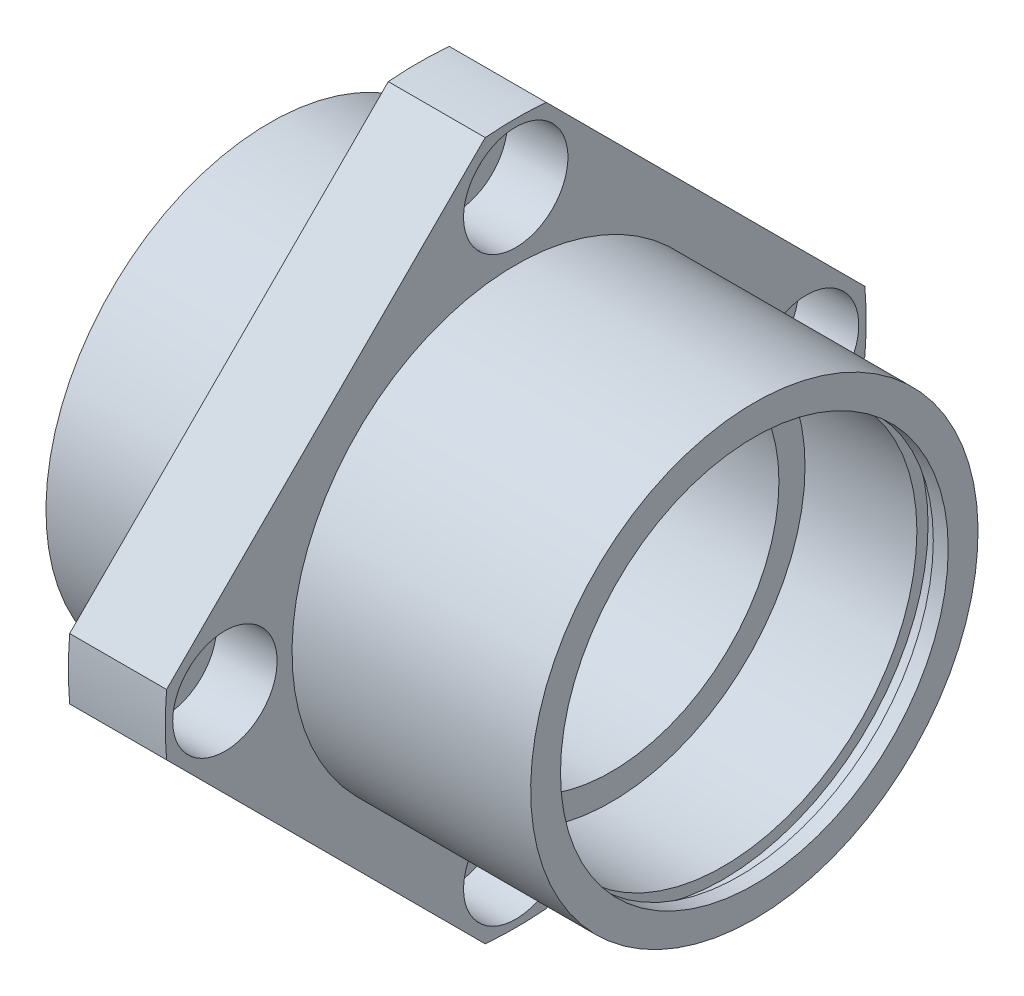
ISO-10303-21;
HEADER;
FILE_DESCRIPTION(('STEP AP214'),'2;1');
FILE_NAME('part.step','',(''),(''),'','','');
FILE_SCHEMA(('AUTOMOTIVE_DESIGN { 1 0 10303 214 1 1 1 1 }'));
ENDSEC;
DATA;
#1=APPLICATION_CONTEXT('core data for automotive mechanical design processes');
#2=APPLICATION_PROTOCOL_DEFINITION('international standard','automotive_design',2000,#1);
#3=PRODUCT_CONTEXT('',#1,'mechanical');
#4=PRODUCT('Part','Part','',(#3));
#5=PRODUCT_RELATED_PRODUCT_CATEGORY('part','',(#4));
#6=PRODUCT_DEFINITION_FORMATION('','',#4);
#7=PRODUCT_DEFINITION_CONTEXT('part definition',#1,'design');
#8=PRODUCT_DEFINITION('design','',#6,#7);
#9=PRODUCT_DEFINITION_SHAPE('','',#8);
#10=(LENGTH_UNIT() NAMED_UNIT(*) SI_UNIT(.MILLI.,.METRE.));
#11=(NAMED_UNIT(*) PLANE_ANGLE_UNIT() SI_UNIT($,.RADIAN.));
#12=(NAMED_UNIT(*) SI_UNIT($,.STERADIAN.) SOLID_ANGLE_UNIT());
#13=UNCERTAINTY_MEASURE_WITH_UNIT(LENGTH_MEASURE(1.E-05),#10,'distance_accuracy_value','');
#14=(GEOMETRIC_REPRESENTATION_CONTEXT(3) GLOBAL_UNCERTAINTY_ASSIGNED_CONTEXT((#13)) GLOBAL_UNIT_ASSIGNED_CONTEXT((#10,
#11,#12)) REPRESENTATION_CONTEXT('',''));
#15=CARTESIAN_POINT('',(0.,0.,0.));
#16=DIRECTION('',(0.,0.,1.));
#17=DIRECTION('',(1.,0.,0.));
#18=AXIS2_PLACEMENT_3D('',#15,#16,#17);
#19=CARTESIAN_POINT('',(-45.,30.,0.));
#20=DIRECTION('',(1.,0.,0.));
#21=DIRECTION('',(0.,1.,0.));
#22=AXIS2_PLACEMENT_3D('',#19,#20,#21);
#23=PLANE('',#22);
#24=CARTESIAN_POINT('',(-45.,0.,-39.));
#25=DIRECTION('',(-1.,0.,0.));
#26=DIRECTION('',(0.,0.,1.));
#27=AXIS2_PLACEMENT_3D('',#24,#25,#26);
#28=CIRCLE('',#27,4.5);
#29=CARTESIAN_POINT('',(-45.,0.,-34.5));
#30=VERTEX_POINT('',#29);
#31=EDGE_CURVE('E226',#30,#30,#28,.T.);
#32=ORIENTED_EDGE('',*,*,#31,.F.);
#33=EDGE_LOOP('',(#32));
#34=FACE_BOUND('',#33,.T.);
#35=CARTESIAN_POINT('',(-45.,-39.,0.));
#36=DIRECTION('',(-1.,0.,0.));
#37=DIRECTION('',(0.,0.,1.));
#38=AXIS2_PLACEMENT_3D('',#35,#36,#37);
#39=CIRCLE('',#38,4.5);
#40=CARTESIAN_POINT('',(-45.,-39.,4.5));
#41=VERTEX_POINT('',#40);
#42=EDGE_CURVE('E214',#41,#41,#39,.T.);
#43=ORIENTED_EDGE('',*,*,#42,.F.);
#44=EDGE_LOOP('',(#43));
#45=FACE_BOUND('',#44,.T.);
#46=CARTESIAN_POINT('',(-45.,0.,39.));
#47=DIRECTION('',(-1.,0.,0.));
#48=DIRECTION('',(0.,0.,1.));
#49=AXIS2_PLACEMENT_3D('',#46,#47,#48);
#50=CIRCLE('',#49,4.5);
#51=CARTESIAN_POINT('',(-45.,0.,43.5));
#52=VERTEX_POINT('',#51);
#53=EDGE_CURVE('E201',#52,#52,#50,.T.);
#54=ORIENTED_EDGE('',*,*,#53,.F.);
#55=EDGE_LOOP('',(#54));
#56=FACE_BOUND('',#55,.T.);
#57=CARTESIAN_POINT('',(-45.,39.,0.));
#58=DIRECTION('',(-1.,0.,0.));
#59=DIRECTION('',(0.,0.,1.));
#60=AXIS2_PLACEMENT_3D('',#57,#58,#59);
#61=CIRCLE('',#60,4.5);
#62=CARTESIAN_POINT('',(-45.,39.,4.5));
#63=VERTEX_POINT('',#62);
#64=EDGE_CURVE('E193',#63,#63,#61,.T.);
#65=ORIENTED_EDGE('',*,*,#64,.F.);
#66=EDGE_LOOP('',(#65));
#67=FACE_BOUND('',#66,.T.);
#68=CARTESIAN_POINT('',(-45.,0.,0.));
#69=DIRECTION('',(-1.,0.,0.));
#70=DIRECTION('',(0.,-1.,0.));
#71=AXIS2_PLACEMENT_3D('',#68,#69,#70);
#72=CIRCLE('',#71,30.);
#73=CARTESIAN_POINT('',(-45.,-30.,0.));
#74=VERTEX_POINT('',#73);
#75=EDGE_CURVE('E262',#74,#74,#72,.T.);
#76=ORIENTED_EDGE('',*,*,#75,.F.);
#77=EDGE_LOOP('',(#76));
#78=FACE_BOUND('',#77,.T.);
#79=DIRECTION('',(0.,-0.707106781186547,0.707106781186548));
#80=VECTOR('',#79,1.);
#81=CARTESIAN_POINT('',(-45.,50.911688245431,0.));
#82=LINE('',#81,#80);
#83=CARTESIAN_POINT('',(-45.,46.8217047419373,4.08998350349376));
#84=VERTEX_POINT('',#83);
#85=CARTESIAN_POINT('',(-45.,4.08998350349378,46.8217047419372));
#86=VERTEX_POINT('',#85);
#87=EDGE_CURVE('E258',#84,#86,#82,.T.);
#88=ORIENTED_EDGE('',*,*,#87,.F.);
#89=CARTESIAN_POINT('',(-45.,0.,0.));
#90=DIRECTION('',(-1.,0.,0.));
#91=DIRECTION('',(0.,-1.,0.));
#92=AXIS2_PLACEMENT_3D('',#89,#90,#91);
#93=CIRCLE('',#92,47.);
#94=CARTESIAN_POINT('',(-45.,46.8217047419373,-4.08998350349373));
#95=VERTEX_POINT('',#94);
#96=EDGE_CURVE('E264',#84,#95,#93,.T.);
#97=ORIENTED_EDGE('',*,*,#96,.T.);
#98=DIRECTION('',(0.,0.707106781186548,0.707106781186548));
#99=VECTOR('',#98,1.);
#100=CARTESIAN_POINT('',(-45.,0.,-50.911688245431));
#101=LINE('',#100,#99);
#102=CARTESIAN_POINT('',(-45.,4.08998350349376,-46.8217047419372));
#103=VERTEX_POINT('',#102);
#104=EDGE_CURVE('E249',#103,#95,#101,.T.);
#105=ORIENTED_EDGE('',*,*,#104,.F.);
#106=CARTESIAN_POINT('',(-45.,-4.08998350349379,-46.8217047419372));
#107=VERTEX_POINT('',#106);
#108=EDGE_CURVE('E135',#103,#107,#93,.T.);
#109=ORIENTED_EDGE('',*,*,#108,.T.);
#110=DIRECTION('',(0.,0.707106781186547,-0.707106781186547));
#111=VECTOR('',#110,1.);
#112=CARTESIAN_POINT('',(-45.,-50.911688245431,0.));
#113=LINE('',#112,#111);
#114=CARTESIAN_POINT('',(-45.,-46.8217047419372,-4.08998350349378));
#115=VERTEX_POINT('',#114);
#116=EDGE_CURVE('E252',#115,#107,#113,.T.);
#117=ORIENTED_EDGE('',*,*,#116,.F.);
#118=CARTESIAN_POINT('',(-45.,-46.8217047419372,4.08998350349377));
#119=VERTEX_POINT('',#118);
#120=EDGE_CURVE('E126',#115,#119,#93,.T.);
#121=ORIENTED_EDGE('',*,*,#120,.T.);
#122=DIRECTION('',(0.,-0.707106781186548,-0.707106781186547));
#123=VECTOR('',#122,1.);
#124=CARTESIAN_POINT('',(-45.,0.,50.911688245431));
#125=LINE('',#124,#123);
#126=CARTESIAN_POINT('',(-45.,-4.08998350349374,46.8217047419372));
#127=VERTEX_POINT('',#126);
#128=EDGE_CURVE('E255',#127,#119,#125,.T.);
#129=ORIENTED_EDGE('',*,*,#128,.F.);
#130=EDGE_CURVE('E123',#127,#86,#93,.T.);
#131=ORIENTED_EDGE('',*,*,#130,.T.);
#132=EDGE_LOOP('',(#88,#97,#105,#109,#117,#121,#129,#131));
#133=FACE_BOUND('',#132,.T.);
#134=ADVANCED_FACE('F39',(#34,#45,#56,#67,#78,#133),#23,.F.);
#135=CARTESIAN_POINT('',(0.,0.,0.));
#136=DIRECTION('',(-1.,0.,0.));
#137=DIRECTION('',(0.,-1.,0.));
#138=AXIS2_PLACEMENT_3D('',#135,#136,#137);
#139=CYLINDRICAL_SURFACE('',#138,47.);
#140=DIRECTION('',(-1.,0.,0.));
#141=VECTOR('',#140,1.);
#142=CARTESIAN_POINT('',(0.,46.8217047419373,4.08998350349375));
#143=LINE('',#142,#141);
#144=CARTESIAN_POINT('',(-32.,46.8217047419372,4.08998350349376));
#145=VERTEX_POINT('',#144);
#146=EDGE_CURVE('E239',#145,#84,#143,.T.);
#147=ORIENTED_EDGE('',*,*,#146,.F.);
#148=CARTESIAN_POINT('',(-32.,0.,0.));
#149=DIRECTION('',(-1.,0.,0.));
#150=DIRECTION('',(0.,-1.,0.));
#151=AXIS2_PLACEMENT_3D('',#148,#149,#150);
#152=CIRCLE('',#151,47.);
#153=CARTESIAN_POINT('',(-32.,46.8217047419373,-4.08998350349374));
#154=VERTEX_POINT('',#153);
#155=EDGE_CURVE('E129',#145,#154,#152,.T.);
#156=ORIENTED_EDGE('',*,*,#155,.T.);
#157=DIRECTION('',(-1.,0.,0.));
#158=VECTOR('',#157,1.);
#159=CARTESIAN_POINT('',(0.,46.8217047419373,-4.08998350349375));
#160=LINE('',#159,#158);
#161=EDGE_CURVE('E61',#95,#154,#160,.F.);
#162=ORIENTED_EDGE('',*,*,#161,.F.);
#163=ORIENTED_EDGE('',*,*,#96,.F.);
#164=EDGE_LOOP('',(#147,#156,#162,#163));
#165=FACE_BOUND('',#164,.T.);
#166=ADVANCED_FACE('F283',(#165),#139,.T.);
#167=DIRECTION('',(-1.,0.,0.));
#168=VECTOR('',#167,1.);
#169=CARTESIAN_POINT('',(0.,4.08998350349378,46.8217047419372));
#170=LINE('',#169,#168);
#171=CARTESIAN_POINT('',(-32.,4.08998350349379,46.8217047419372));
#172=VERTEX_POINT('',#171);
#173=EDGE_CURVE('E244',#86,#172,#170,.F.);
#174=ORIENTED_EDGE('',*,*,#173,.F.);
#175=ORIENTED_EDGE('',*,*,#130,.F.);
#176=DIRECTION('',(-1.,0.,0.));
#177=VECTOR('',#176,1.);
#178=CARTESIAN_POINT('',(0.,-4.08998350349373,46.8217047419372));
#179=LINE('',#178,#177);
#180=CARTESIAN_POINT('',(-32.,-4.08998350349372,46.8217047419373));
#181=VERTEX_POINT('',#180);
#182=EDGE_CURVE('E104',#181,#127,#179,.T.);
#183=ORIENTED_EDGE('',*,*,#182,.F.);
#184=EDGE_CURVE('E122',#181,#172,#152,.T.);
#185=ORIENTED_EDGE('',*,*,#184,.T.);
#186=EDGE_LOOP('',(#174,#175,#183,#185));
#187=FACE_BOUND('',#186,.T.);
#188=ADVANCED_FACE('F117',(#187),#139,.T.);
#189=DIRECTION('',(-1.,0.,0.));
#190=VECTOR('',#189,1.);
#191=CARTESIAN_POINT('',(0.,4.08998350349377,-46.8217047419372));
#192=LINE('',#191,#190);
#193=CARTESIAN_POINT('',(-32.,4.08998350349375,-46.8217047419372));
#194=VERTEX_POINT('',#193);
#195=EDGE_CURVE('E245',#194,#103,#192,.T.);
#196=ORIENTED_EDGE('',*,*,#195,.F.);
#197=CARTESIAN_POINT('',(-32.,-4.08998350349376,-46.8217047419372));
#198=VERTEX_POINT('',#197);
#199=EDGE_CURVE('E138',#194,#198,#152,.T.);
#200=ORIENTED_EDGE('',*,*,#199,.T.);
#201=DIRECTION('',(-1.,0.,0.));
#202=VECTOR('',#201,1.);
#203=CARTESIAN_POINT('',(0.,-4.08998350349378,-46.8217047419372));
#204=LINE('',#203,#202);
#205=EDGE_CURVE('E53',#107,#198,#204,.F.);
#206=ORIENTED_EDGE('',*,*,#205,.F.);
#207=ORIENTED_EDGE('',*,*,#108,.F.);
#208=EDGE_LOOP('',(#196,#200,#206,#207));
#209=FACE_BOUND('',#208,.T.);
#210=ADVANCED_FACE('F280',(#209),#139,.T.);
#211=DIRECTION('',(-1.,0.,0.));
#212=VECTOR('',#211,1.);
#213=CARTESIAN_POINT('',(0.,-46.8217047419372,-4.08998350349379));
#214=LINE('',#213,#212);
#215=CARTESIAN_POINT('',(-32.,-46.8217047419372,-4.08998350349377));
#216=VERTEX_POINT('',#215);
#217=EDGE_CURVE('E248',#216,#115,#214,.T.);
#218=ORIENTED_EDGE('',*,*,#217,.F.);
#219=CARTESIAN_POINT('',(-32.,-46.8217047419372,4.08998350349374));
#220=VERTEX_POINT('',#219);
#221=EDGE_CURVE('E134',#216,#220,#152,.T.);
#222=ORIENTED_EDGE('',*,*,#221,.T.);
#223=DIRECTION('',(-1.,0.,0.));
#224=VECTOR('',#223,1.);
#225=CARTESIAN_POINT('',(0.,-46.8217047419372,4.08998350349377));
#226=LINE('',#225,#224);
#227=EDGE_CURVE('E107',#119,#220,#226,.F.);
#228=ORIENTED_EDGE('',*,*,#227,.F.);
#229=ORIENTED_EDGE('',*,*,#120,.F.);
#230=EDGE_LOOP('',(#218,#222,#228,#229));
#231=FACE_BOUND('',#230,.T.);
#232=ADVANCED_FACE('F281',(#231),#139,.T.);
#233=CARTESIAN_POINT('',(-32.,47.,0.));
#234=DIRECTION('',(-1.,0.,0.));
#235=DIRECTION('',(0.,-1.,0.));
#236=AXIS2_PLACEMENT_3D('',#233,#234,#235);
#237=PLANE('',#236);
#238=CARTESIAN_POINT('',(-32.,0.,-39.));
#239=DIRECTION('',(-1.,0.,0.));
#240=DIRECTION('',(0.,0.,1.));
#241=AXIS2_PLACEMENT_3D('',#238,#239,#240);
#242=CIRCLE('',#241,7.);
#243=CARTESIAN_POINT('',(-32.,0.,-32.));
#244=VERTEX_POINT('',#243);
#245=EDGE_CURVE('E237',#244,#244,#242,.T.);
#246=ORIENTED_EDGE('',*,*,#245,.T.);
#247=EDGE_LOOP('',(#246));
#248=FACE_BOUND('',#247,.T.);
#249=CARTESIAN_POINT('',(-32.,-39.,0.));
#250=DIRECTION('',(-1.,0.,0.));
#251=DIRECTION('',(0.,0.,1.));
#252=AXIS2_PLACEMENT_3D('',#249,#250,#251);
#253=CIRCLE('',#252,7.);
#254=CARTESIAN_POINT('',(-32.,-39.,7.));
#255=VERTEX_POINT('',#254);
#256=EDGE_CURVE('E221',#255,#255,#253,.T.);
#257=ORIENTED_EDGE('',*,*,#256,.T.);
#258=EDGE_LOOP('',(#257));
#259=FACE_BOUND('',#258,.T.);
#260=CARTESIAN_POINT('',(-32.,0.,39.));
#261=DIRECTION('',(-1.,0.,0.));
#262=DIRECTION('',(0.,0.,1.));
#263=AXIS2_PLACEMENT_3D('',#260,#261,#262);
#264=CIRCLE('',#263,7.);
#265=CARTESIAN_POINT('',(-32.,0.,46.));
#266=VERTEX_POINT('',#265);
#267=EDGE_CURVE('E215',#266,#266,#264,.T.);
#268=ORIENTED_EDGE('',*,*,#267,.T.);
#269=EDGE_LOOP('',(#268));
#270=FACE_BOUND('',#269,.T.);
#271=CARTESIAN_POINT('',(-32.,39.,0.));
#272=DIRECTION('',(-1.,0.,0.));
#273=DIRECTION('',(0.,0.,1.));
#274=AXIS2_PLACEMENT_3D('',#271,#272,#273);
#275=CIRCLE('',#274,7.);
#276=CARTESIAN_POINT('',(-32.,39.,7.));
#277=VERTEX_POINT('',#276);
#278=EDGE_CURVE('E199',#277,#277,#275,.T.);
#279=ORIENTED_EDGE('',*,*,#278,.T.);
#280=EDGE_LOOP('',(#279));
#281=FACE_BOUND('',#280,.T.);
#282=CARTESIAN_POINT('',(-32.,0.,0.));
#283=DIRECTION('',(-1.,0.,0.));
#284=DIRECTION('',(0.,-1.,0.));
#285=AXIS2_PLACEMENT_3D('',#282,#283,#284);
#286=CIRCLE('',#285,30.);
#287=CARTESIAN_POINT('',(-32.,-30.,0.));
#288=VERTEX_POINT('',#287);
#289=EDGE_CURVE('E136',#288,#288,#286,.T.);
#290=ORIENTED_EDGE('',*,*,#289,.T.);
#291=EDGE_LOOP('',(#290));
#292=FACE_BOUND('',#291,.T.);
#293=DIRECTION('',(0.,0.707106781186547,-0.707106781186548));
#294=VECTOR('',#293,1.);
#295=CARTESIAN_POINT('',(-32.,48.9558441227155,1.95584412271551));
#296=LINE('',#295,#294);
#297=EDGE_CURVE('E11',#172,#145,#296,.T.);
#298=ORIENTED_EDGE('',*,*,#297,.F.);
#299=ORIENTED_EDGE('',*,*,#184,.F.);
#300=DIRECTION('',(0.,0.707106781186548,0.707106781186547));
#301=VECTOR('',#300,1.);
#302=CARTESIAN_POINT('',(-32.,-1.95584412271546,48.9558441227155));
#303=LINE('',#302,#301);
#304=EDGE_CURVE('E105',#220,#181,#303,.T.);
#305=ORIENTED_EDGE('',*,*,#304,.F.);
#306=ORIENTED_EDGE('',*,*,#221,.F.);
#307=DIRECTION('',(0.,-0.707106781186548,0.707106781186548));
#308=VECTOR('',#307,1.);
#309=CARTESIAN_POINT('',(-32.,-1.9558441227155,-48.9558441227155));
#310=LINE('',#309,#308);
#311=EDGE_CURVE('E114',#198,#216,#310,.T.);
#312=ORIENTED_EDGE('',*,*,#311,.F.);
#313=ORIENTED_EDGE('',*,*,#199,.F.);
#314=DIRECTION('',(0.,-0.707106781186547,-0.707106781186548));
#315=VECTOR('',#314,1.);
#316=CARTESIAN_POINT('',(-32.,48.9558441227155,-1.95584412271549));
#317=LINE('',#316,#315);
#318=EDGE_CURVE('E50',#154,#194,#317,.T.);
#319=ORIENTED_EDGE('',*,*,#318,.F.);
#320=ORIENTED_EDGE('',*,*,#155,.F.);
#321=EDGE_LOOP('',(#298,#299,#305,#306,#312,#313,#319,#320));
#322=FACE_BOUND('',#321,.T.);
#323=ADVANCED_FACE('F127',(#248,#259,#270,#281,#292,#322),#237,.F.);
#324=CARTESIAN_POINT('',(-65.,0.,0.));
#325=DIRECTION('',(1.,0.,0.));
#326=DIRECTION('',(0.,1.,0.));
#327=AXIS2_PLACEMENT_3D('',#324,#325,#326);
#328=PLANE('',#327);
#329=CARTESIAN_POINT('',(-65.,0.,0.));
#330=DIRECTION('',(-1.,0.,0.));
#331=DIRECTION('',(0.,0.,1.));
#332=AXIS2_PLACEMENT_3D('',#329,#330,#331);
#333=CIRCLE('',#332,26.);
#334=CARTESIAN_POINT('',(-65.,0.,26.));
#335=VERTEX_POINT('',#334);
#336=EDGE_CURVE('E150',#335,#335,#333,.T.);
#337=ORIENTED_EDGE('',*,*,#336,.F.);
#338=EDGE_LOOP('',(#337));
#339=FACE_BOUND('',#338,.T.);
#340=CARTESIAN_POINT('',(-65.,0.,0.));
#341=DIRECTION('',(-1.,0.,0.));
#342=DIRECTION('',(0.,-1.,0.));
#343=AXIS2_PLACEMENT_3D('',#340,#341,#342);
#344=CIRCLE('',#343,30.);
#345=CARTESIAN_POINT('',(-65.,-30.,0.));
#346=VERTEX_POINT('',#345);
#347=EDGE_CURVE('E111',#346,#346,#344,.T.);
#348=ORIENTED_EDGE('',*,*,#347,.T.);
#349=EDGE_LOOP('',(#348));
#350=FACE_BOUND('',#349,.T.);
#351=ADVANCED_FACE('F41',(#339,#350),#328,.F.);
#352=CARTESIAN_POINT('',(0.,0.,0.));
#353=DIRECTION('',(-1.,0.,0.));
#354=DIRECTION('',(0.,-1.,0.));
#355=AXIS2_PLACEMENT_3D('',#352,#353,#354);
#356=CYLINDRICAL_SURFACE('',#355,30.);
#357=ORIENTED_EDGE('',*,*,#347,.F.);
#358=EDGE_LOOP('',(#357));
#359=FACE_BOUND('',#358,.T.);
#360=ORIENTED_EDGE('',*,*,#75,.T.);
#361=EDGE_LOOP('',(#360));
#362=FACE_BOUND('',#361,.T.);
#363=ADVANCED_FACE('F443',(#359,#362),#356,.T.);
#364=CARTESIAN_POINT('',(0.,0.,0.));
#365=DIRECTION('',(-1.,0.,0.));
#366=DIRECTION('',(0.,-1.,0.));
#367=AXIS2_PLACEMENT_3D('',#364,#365,#366);
#368=CYLINDRICAL_SURFACE('',#367,30.);
#369=ORIENTED_EDGE('',*,*,#289,.F.);
#370=EDGE_LOOP('',(#369));
#371=FACE_BOUND('',#370,.T.);
#372=CARTESIAN_POINT('',(0.,0.,0.));
#373=DIRECTION('',(-1.,0.,0.));
#374=DIRECTION('',(0.,-1.,0.));
#375=AXIS2_PLACEMENT_3D('',#372,#373,#374);
#376=CIRCLE('',#375,30.);
#377=CARTESIAN_POINT('',(0.,-30.,0.));
#378=VERTEX_POINT('',#377);
#379=EDGE_CURVE('E141',#378,#378,#376,.T.);
#380=ORIENTED_EDGE('',*,*,#379,.T.);
#381=EDGE_LOOP('',(#380));
#382=FACE_BOUND('',#381,.T.);
#383=ADVANCED_FACE('F445',(#371,#382),#368,.T.);
#384=CARTESIAN_POINT('',(0.,30.,0.));
#385=DIRECTION('',(-1.,0.,0.));
#386=DIRECTION('',(0.,-1.,0.));
#387=AXIS2_PLACEMENT_3D('',#384,#385,#386);
#388=PLANE('',#387);
#389=CARTESIAN_POINT('',(0.,0.,0.));
#390=DIRECTION('',(-1.,0.,0.));
#391=DIRECTION('',(0.,0.,1.));
#392=AXIS2_PLACEMENT_3D('',#389,#390,#391);
#393=CIRCLE('',#392,26.);
#394=CARTESIAN_POINT('',(0.,0.,26.));
#395=VERTEX_POINT('',#394);
#396=EDGE_CURVE('E190',#395,#395,#393,.T.);
#397=ORIENTED_EDGE('',*,*,#396,.T.);
#398=EDGE_LOOP('',(#397));
#399=FACE_BOUND('',#398,.T.);
#400=ORIENTED_EDGE('',*,*,#379,.F.);
#401=EDGE_LOOP('',(#400));
#402=FACE_BOUND('',#401,.T.);
#403=ADVANCED_FACE('F437',(#399,#402),#388,.F.);
#404=CARTESIAN_POINT('',(0.,0.,0.));
#405=DIRECTION('',(-1.,0.,0.));
#406=DIRECTION('',(0.,0.,1.));
#407=AXIS2_PLACEMENT_3D('',#404,#405,#406);
#408=CYLINDRICAL_SURFACE('',#407,26.);
#409=ORIENTED_EDGE('',*,*,#336,.T.);
#410=EDGE_LOOP('',(#409));
#411=FACE_BOUND('',#410,.T.);
#412=CARTESIAN_POINT('',(-63.,0.,0.));
#413=DIRECTION('',(-1.,0.,0.));
#414=DIRECTION('',(0.,0.,1.));
#415=AXIS2_PLACEMENT_3D('',#412,#413,#414);
#416=CIRCLE('',#415,26.);
#417=CARTESIAN_POINT('',(-63.,0.,26.));
#418=VERTEX_POINT('',#417);
#419=EDGE_CURVE('E155',#418,#418,#416,.T.);
#420=ORIENTED_EDGE('',*,*,#419,.F.);
#421=EDGE_LOOP('',(#420));
#422=FACE_BOUND('',#421,.T.);
#423=ADVANCED_FACE('F432',(#411,#422),#408,.F.);
#424=CARTESIAN_POINT('',(-63.,26.,0.));
#425=DIRECTION('',(1.,0.,0.));
#426=DIRECTION('',(0.,0.,-1.));
#427=AXIS2_PLACEMENT_3D('',#424,#425,#426);
#428=PLANE('',#427);
#429=ORIENTED_EDGE('',*,*,#419,.T.);
#430=EDGE_LOOP('',(#429));
#431=FACE_BOUND('',#430,.T.);
#432=CARTESIAN_POINT('',(-63.,0.,0.));
#433=DIRECTION('',(-1.,0.,0.));
#434=DIRECTION('',(0.,0.,1.));
#435=AXIS2_PLACEMENT_3D('',#432,#433,#434);
#436=CIRCLE('',#435,27.5);
#437=CARTESIAN_POINT('',(-63.,0.,27.5));
#438=VERTEX_POINT('',#437);
#439=EDGE_CURVE('E154',#438,#438,#436,.T.);
#440=ORIENTED_EDGE('',*,*,#439,.F.);
#441=EDGE_LOOP('',(#440));
#442=FACE_BOUND('',#441,.T.);
#443=ADVANCED_FACE('F429',(#431,#442),#428,.T.);
#444=CARTESIAN_POINT('',(0.,0.,0.));
#445=DIRECTION('',(-1.,0.,0.));
#446=DIRECTION('',(0.,0.,1.));
#447=AXIS2_PLACEMENT_3D('',#444,#445,#446);
#448=CYLINDRICAL_SURFACE('',#447,27.5);
#449=ORIENTED_EDGE('',*,*,#439,.T.);
#450=EDGE_LOOP('',(#449));
#451=FACE_BOUND('',#450,.T.);
#452=CARTESIAN_POINT('',(-60.8,0.,0.));
#453=DIRECTION('',(-1.,0.,0.));
#454=DIRECTION('',(0.,0.,1.));
#455=AXIS2_PLACEMENT_3D('',#452,#453,#454);
#456=CIRCLE('',#455,27.5);
#457=CARTESIAN_POINT('',(-60.8,0.,27.5));
#458=VERTEX_POINT('',#457);
#459=EDGE_CURVE('E158',#458,#458,#456,.T.);
#460=ORIENTED_EDGE('',*,*,#459,.F.);
#461=EDGE_LOOP('',(#460));
#462=FACE_BOUND('',#461,.T.);
#463=ADVANCED_FACE('F426',(#451,#462),#448,.F.);
#464=CARTESIAN_POINT('',(-60.8,27.5,0.));
#465=DIRECTION('',(-1.,0.,0.));
#466=DIRECTION('',(0.,0.,1.));
#467=AXIS2_PLACEMENT_3D('',#464,#465,#466);
#468=PLANE('',#467);
#469=ORIENTED_EDGE('',*,*,#459,.T.);
#470=EDGE_LOOP('',(#469));
#471=FACE_BOUND('',#470,.T.);
#472=CARTESIAN_POINT('',(-60.8,0.,0.));
#473=DIRECTION('',(-1.,0.,0.));
#474=DIRECTION('',(0.,0.,1.));
#475=AXIS2_PLACEMENT_3D('',#472,#473,#474);
#476=CIRCLE('',#475,26.);
#477=CARTESIAN_POINT('',(-60.8,0.,26.));
#478=VERTEX_POINT('',#477);
#479=EDGE_CURVE('E161',#478,#478,#476,.T.);
#480=ORIENTED_EDGE('',*,*,#479,.F.);
#481=EDGE_LOOP('',(#480));
#482=FACE_BOUND('',#481,.T.);
#483=ADVANCED_FACE('F425',(#471,#482),#468,.T.);
#484=CARTESIAN_POINT('',(0.,0.,0.));
#485=DIRECTION('',(-1.,0.,0.));
#486=DIRECTION('',(0.,0.,1.));
#487=AXIS2_PLACEMENT_3D('',#484,#485,#486);
#488=CYLINDRICAL_SURFACE('',#487,26.);
#489=ORIENTED_EDGE('',*,*,#479,.T.);
#490=EDGE_LOOP('',(#489));
#491=FACE_BOUND('',#490,.T.);
#492=CARTESIAN_POINT('',(-45.8,0.,0.));
#493=DIRECTION('',(-1.,0.,0.));
#494=DIRECTION('',(0.,0.,1.));
#495=AXIS2_PLACEMENT_3D('',#492,#493,#494);
#496=CIRCLE('',#495,26.);
#497=CARTESIAN_POINT('',(-45.8,0.,26.));
#498=VERTEX_POINT('',#497);
#499=EDGE_CURVE('E163',#498,#498,#496,.T.);
#500=ORIENTED_EDGE('',*,*,#499,.F.);
#501=EDGE_LOOP('',(#500));
#502=FACE_BOUND('',#501,.T.);
#503=ADVANCED_FACE('F416',(#491,#502),#488,.F.);
#504=CARTESIAN_POINT('',(-45.8,26.,0.));
#505=DIRECTION('',(-1.,0.,0.));
#506=DIRECTION('',(0.,0.,1.));
#507=AXIS2_PLACEMENT_3D('',#504,#505,#506);
#508=PLANE('',#507);
#509=ORIENTED_EDGE('',*,*,#499,.T.);
#510=EDGE_LOOP('',(#509));
#511=FACE_BOUND('',#510,.T.);
#512=CARTESIAN_POINT('',(-45.8,0.,0.));
#513=DIRECTION('',(-1.,0.,0.));
#514=DIRECTION('',(0.,0.,1.));
#515=AXIS2_PLACEMENT_3D('',#512,#513,#514);
#516=CIRCLE('',#515,22.5);
#517=CARTESIAN_POINT('',(-45.8,0.,22.5));
#518=VERTEX_POINT('',#517);
#519=EDGE_CURVE('E170',#518,#518,#516,.T.);
#520=ORIENTED_EDGE('',*,*,#519,.F.);
#521=EDGE_LOOP('',(#520));
#522=FACE_BOUND('',#521,.T.);
#523=ADVANCED_FACE('F412',(#511,#522),#508,.T.);
#524=CARTESIAN_POINT('',(0.,0.,0.));
#525=DIRECTION('',(-1.,0.,0.));
#526=DIRECTION('',(0.,0.,1.));
#527=AXIS2_PLACEMENT_3D('',#524,#525,#526);
#528=CYLINDRICAL_SURFACE('',#527,22.5);
#529=ORIENTED_EDGE('',*,*,#519,.T.);
#530=EDGE_LOOP('',(#529));
#531=FACE_BOUND('',#530,.T.);
#532=CARTESIAN_POINT('',(-19.2,0.,0.));
#533=DIRECTION('',(-1.,0.,0.));
#534=DIRECTION('',(0.,0.,1.));
#535=AXIS2_PLACEMENT_3D('',#532,#533,#534);
#536=CIRCLE('',#535,22.5);
#537=CARTESIAN_POINT('',(-19.2,0.,22.5));
#538=VERTEX_POINT('',#537);
#539=EDGE_CURVE('E168',#538,#538,#536,.T.);
#540=ORIENTED_EDGE('',*,*,#539,.F.);
#541=EDGE_LOOP('',(#540));
#542=FACE_BOUND('',#541,.T.);
#543=ADVANCED_FACE('F407',(#531,#542),#528,.F.);
#544=CARTESIAN_POINT('',(-19.2,22.5,0.));
#545=DIRECTION('',(1.,0.,0.));
#546=DIRECTION('',(0.,0.,-1.));
#547=AXIS2_PLACEMENT_3D('',#544,#545,#546);
#548=PLANE('',#547);
#549=ORIENTED_EDGE('',*,*,#539,.T.);
#550=EDGE_LOOP('',(#549));
#551=FACE_BOUND('',#550,.T.);
#552=CARTESIAN_POINT('',(-19.2,0.,0.));
#553=DIRECTION('',(-1.,0.,0.));
#554=DIRECTION('',(0.,0.,1.));
#555=AXIS2_PLACEMENT_3D('',#552,#553,#554);
#556=CIRCLE('',#555,26.);
#557=CARTESIAN_POINT('',(-19.2,0.,26.));
#558=VERTEX_POINT('',#557);
#559=EDGE_CURVE('E175',#558,#558,#556,.T.);
#560=ORIENTED_EDGE('',*,*,#559,.F.);
#561=EDGE_LOOP('',(#560));
#562=FACE_BOUND('',#561,.T.);
#563=ADVANCED_FACE('F409',(#551,#562),#548,.T.);
#564=CARTESIAN_POINT('',(0.,0.,0.));
#565=DIRECTION('',(-1.,0.,0.));
#566=DIRECTION('',(0.,0.,1.));
#567=AXIS2_PLACEMENT_3D('',#564,#565,#566);
#568=CYLINDRICAL_SURFACE('',#567,26.);
#569=ORIENTED_EDGE('',*,*,#559,.T.);
#570=EDGE_LOOP('',(#569));
#571=FACE_BOUND('',#570,.T.);
#572=CARTESIAN_POINT('',(-4.2,0.,0.));
#573=DIRECTION('',(-1.,0.,0.));
#574=DIRECTION('',(0.,0.,1.));
#575=AXIS2_PLACEMENT_3D('',#572,#573,#574);
#576=CIRCLE('',#575,26.);
#577=CARTESIAN_POINT('',(-4.2,0.,26.));
#578=VERTEX_POINT('',#577);
#579=EDGE_CURVE('E177',#578,#578,#576,.T.);
#580=ORIENTED_EDGE('',*,*,#579,.F.);
#581=EDGE_LOOP('',(#580));
#582=FACE_BOUND('',#581,.T.);
#583=ADVANCED_FACE('F405',(#571,#582),#568,.F.);
#584=CARTESIAN_POINT('',(-4.2,26.,0.));
#585=DIRECTION('',(1.,0.,0.));
#586=DIRECTION('',(0.,0.,-1.));
#587=AXIS2_PLACEMENT_3D('',#584,#585,#586);
#588=PLANE('',#587);
#589=ORIENTED_EDGE('',*,*,#579,.T.);
#590=EDGE_LOOP('',(#589));
#591=FACE_BOUND('',#590,.T.);
#592=CARTESIAN_POINT('',(-4.2,0.,0.));
#593=DIRECTION('',(-1.,0.,0.));
#594=DIRECTION('',(0.,0.,1.));
#595=AXIS2_PLACEMENT_3D('',#592,#593,#594);
#596=CIRCLE('',#595,27.5);
#597=CARTESIAN_POINT('',(-4.2,0.,27.5));
#598=VERTEX_POINT('',#597);
#599=EDGE_CURVE('E179',#598,#598,#596,.T.);
#600=ORIENTED_EDGE('',*,*,#599,.F.);
#601=EDGE_LOOP('',(#600));
#602=FACE_BOUND('',#601,.T.);
#603=ADVANCED_FACE('F398',(#591,#602),#588,.T.);
#604=CARTESIAN_POINT('',(0.,0.,0.));
#605=DIRECTION('',(-1.,0.,0.));
#606=DIRECTION('',(0.,0.,1.));
#607=AXIS2_PLACEMENT_3D('',#604,#605,#606);
#608=CYLINDRICAL_SURFACE('',#607,27.5);
#609=ORIENTED_EDGE('',*,*,#599,.T.);
#610=EDGE_LOOP('',(#609));
#611=FACE_BOUND('',#610,.T.);
#612=CARTESIAN_POINT('',(-2.,0.,0.));
#613=DIRECTION('',(-1.,0.,0.));
#614=DIRECTION('',(0.,0.,1.));
#615=AXIS2_PLACEMENT_3D('',#612,#613,#614);
#616=CIRCLE('',#615,27.5);
#617=CARTESIAN_POINT('',(-2.,0.,27.5));
#618=VERTEX_POINT('',#617);
#619=EDGE_CURVE('E185',#618,#618,#616,.T.);
#620=ORIENTED_EDGE('',*,*,#619,.F.);
#621=EDGE_LOOP('',(#620));
#622=FACE_BOUND('',#621,.T.);
#623=ADVANCED_FACE('F393',(#611,#622),#608,.F.);
#624=CARTESIAN_POINT('',(-2.,27.5,0.));
#625=DIRECTION('',(-1.,0.,0.));
#626=DIRECTION('',(0.,0.,1.));
#627=AXIS2_PLACEMENT_3D('',#624,#625,#626);
#628=PLANE('',#627);
#629=ORIENTED_EDGE('',*,*,#619,.T.);
#630=EDGE_LOOP('',(#629));
#631=FACE_BOUND('',#630,.T.);
#632=CARTESIAN_POINT('',(-2.,0.,0.));
#633=DIRECTION('',(-1.,0.,0.));
#634=DIRECTION('',(0.,0.,1.));
#635=AXIS2_PLACEMENT_3D('',#632,#633,#634);
#636=CIRCLE('',#635,26.);
#637=CARTESIAN_POINT('',(-2.,0.,26.));
#638=VERTEX_POINT('',#637);
#639=EDGE_CURVE('E183',#638,#638,#636,.T.);
#640=ORIENTED_EDGE('',*,*,#639,.F.);
#641=EDGE_LOOP('',(#640));
#642=FACE_BOUND('',#641,.T.);
#643=ADVANCED_FACE('F388',(#631,#642),#628,.T.);
#644=CARTESIAN_POINT('',(0.,0.,0.));
#645=DIRECTION('',(-1.,0.,0.));
#646=DIRECTION('',(0.,0.,1.));
#647=AXIS2_PLACEMENT_3D('',#644,#645,#646);
#648=CYLINDRICAL_SURFACE('',#647,26.);
#649=ORIENTED_EDGE('',*,*,#639,.T.);
#650=EDGE_LOOP('',(#649));
#651=FACE_BOUND('',#650,.T.);
#652=ORIENTED_EDGE('',*,*,#396,.F.);
#653=EDGE_LOOP('',(#652));
#654=FACE_BOUND('',#653,.T.);
#655=ADVANCED_FACE('F387',(#651,#654),#648,.F.);
#656=CARTESIAN_POINT('',(-32.,39.,0.));
#657=DIRECTION('',(-1.,0.,0.));
#658=DIRECTION('',(0.,0.,1.));
#659=AXIS2_PLACEMENT_3D('',#656,#657,#658);
#660=CYLINDRICAL_SURFACE('',#659,4.5);
#661=ORIENTED_EDGE('',*,*,#64,.T.);
#662=EDGE_LOOP('',(#661));
#663=FACE_BOUND('',#662,.T.);
#664=CARTESIAN_POINT('',(-40.1,39.,0.));
#665=DIRECTION('',(-1.,0.,0.));
#666=DIRECTION('',(0.,0.,1.));
#667=AXIS2_PLACEMENT_3D('',#664,#665,#666);
#668=CIRCLE('',#667,4.5);
#669=CARTESIAN_POINT('',(-40.1,39.,4.5));
#670=VERTEX_POINT('',#669);
#671=EDGE_CURVE('E192',#670,#670,#668,.T.);
#672=ORIENTED_EDGE('',*,*,#671,.F.);
#673=EDGE_LOOP('',(#672));
#674=FACE_BOUND('',#673,.T.);
#675=ADVANCED_FACE('F385',(#663,#674),#660,.F.);
#676=CARTESIAN_POINT('',(-40.1,43.5,0.));
#677=DIRECTION('',(1.,0.,0.));
#678=DIRECTION('',(0.,0.,-1.));
#679=AXIS2_PLACEMENT_3D('',#676,#677,#678);
#680=PLANE('',#679);
#681=ORIENTED_EDGE('',*,*,#671,.T.);
#682=EDGE_LOOP('',(#681));
#683=FACE_BOUND('',#682,.T.);
#684=CARTESIAN_POINT('',(-40.1,39.,0.));
#685=DIRECTION('',(-1.,0.,0.));
#686=DIRECTION('',(0.,0.,1.));
#687=AXIS2_PLACEMENT_3D('',#684,#685,#686);
#688=CIRCLE('',#687,7.);
#689=CARTESIAN_POINT('',(-40.1,39.,7.));
#690=VERTEX_POINT('',#689);
#691=EDGE_CURVE('E197',#690,#690,#688,.T.);
#692=ORIENTED_EDGE('',*,*,#691,.F.);
#693=EDGE_LOOP('',(#692));
#694=FACE_BOUND('',#693,.T.);
#695=ADVANCED_FACE('F378',(#683,#694),#680,.T.);
#696=CARTESIAN_POINT('',(-32.,39.,0.));
#697=DIRECTION('',(-1.,0.,0.));
#698=DIRECTION('',(0.,0.,1.));
#699=AXIS2_PLACEMENT_3D('',#696,#697,#698);
#700=CYLINDRICAL_SURFACE('',#699,7.);
#701=ORIENTED_EDGE('',*,*,#691,.T.);
#702=EDGE_LOOP('',(#701));
#703=FACE_BOUND('',#702,.T.);
#704=ORIENTED_EDGE('',*,*,#278,.F.);
#705=EDGE_LOOP('',(#704));
#706=FACE_BOUND('',#705,.T.);
#707=ADVANCED_FACE('F372',(#703,#706),#700,.F.);
#708=CARTESIAN_POINT('',(-32.,0.,39.));
#709=DIRECTION('',(-1.,0.,0.));
#710=DIRECTION('',(0.,0.,1.));
#711=AXIS2_PLACEMENT_3D('',#708,#709,#710);
#712=CYLINDRICAL_SURFACE('',#711,4.5);
#713=ORIENTED_EDGE('',*,*,#53,.T.);
#714=EDGE_LOOP('',(#713));
#715=FACE_BOUND('',#714,.T.);
#716=CARTESIAN_POINT('',(-40.1,0.,39.));
#717=DIRECTION('',(-1.,0.,0.));
#718=DIRECTION('',(0.,0.,1.));
#719=AXIS2_PLACEMENT_3D('',#716,#717,#718);
#720=CIRCLE('',#719,4.5);
#721=CARTESIAN_POINT('',(-40.1,0.,43.5));
#722=VERTEX_POINT('',#721);
#723=EDGE_CURVE('E206',#722,#722,#720,.T.);
#724=ORIENTED_EDGE('',*,*,#723,.F.);
#725=EDGE_LOOP('',(#724));
#726=FACE_BOUND('',#725,.T.);
#727=ADVANCED_FACE('F367',(#715,#726),#712,.F.);
#728=CARTESIAN_POINT('',(-40.1,4.5,39.));
#729=DIRECTION('',(1.,0.,0.));
#730=DIRECTION('',(0.,0.,-1.));
#731=AXIS2_PLACEMENT_3D('',#728,#729,#730);
#732=PLANE('',#731);
#733=ORIENTED_EDGE('',*,*,#723,.T.);
#734=EDGE_LOOP('',(#733));
#735=FACE_BOUND('',#734,.T.);
#736=CARTESIAN_POINT('',(-40.1,0.,39.));
#737=DIRECTION('',(-1.,0.,0.));
#738=DIRECTION('',(0.,0.,1.));
#739=AXIS2_PLACEMENT_3D('',#736,#737,#738);
#740=CIRCLE('',#739,7.);
#741=CARTESIAN_POINT('',(-40.1,0.,46.));
#742=VERTEX_POINT('',#741);
#743=EDGE_CURVE('E207',#742,#742,#740,.T.);
#744=ORIENTED_EDGE('',*,*,#743,.F.);
#745=EDGE_LOOP('',(#744));
#746=FACE_BOUND('',#745,.T.);
#747=ADVANCED_FACE('F368',(#735,#746),#732,.T.);
#748=CARTESIAN_POINT('',(-32.,0.,39.));
#749=DIRECTION('',(-1.,0.,0.));
#750=DIRECTION('',(0.,0.,1.));
#751=AXIS2_PLACEMENT_3D('',#748,#749,#750);
#752=CYLINDRICAL_SURFACE('',#751,7.);
#753=ORIENTED_EDGE('',*,*,#743,.T.);
#754=EDGE_LOOP('',(#753));
#755=FACE_BOUND('',#754,.T.);
#756=ORIENTED_EDGE('',*,*,#267,.F.);
#757=EDGE_LOOP('',(#756));
#758=FACE_BOUND('',#757,.T.);
#759=ADVANCED_FACE('F362',(#755,#758),#752,.F.);
#760=CARTESIAN_POINT('',(-32.,-39.,0.));
#761=DIRECTION('',(-1.,0.,0.));
#762=DIRECTION('',(0.,0.,1.));
#763=AXIS2_PLACEMENT_3D('',#760,#761,#762);
#764=CYLINDRICAL_SURFACE('',#763,4.5);
#765=ORIENTED_EDGE('',*,*,#42,.T.);
#766=EDGE_LOOP('',(#765));
#767=FACE_BOUND('',#766,.T.);
#768=CARTESIAN_POINT('',(-40.1,-39.,0.));
#769=DIRECTION('',(-1.,0.,0.));
#770=DIRECTION('',(0.,0.,1.));
#771=AXIS2_PLACEMENT_3D('',#768,#769,#770);
#772=CIRCLE('',#771,4.5);
#773=CARTESIAN_POINT('',(-40.1,-39.,4.5));
#774=VERTEX_POINT('',#773);
#775=EDGE_CURVE('E217',#774,#774,#772,.T.);
#776=ORIENTED_EDGE('',*,*,#775,.F.);
#777=EDGE_LOOP('',(#776));
#778=FACE_BOUND('',#777,.T.);
#779=ADVANCED_FACE('F356',(#767,#778),#764,.F.);
#780=CARTESIAN_POINT('',(-40.1,-34.5,0.));
#781=DIRECTION('',(1.,0.,0.));
#782=DIRECTION('',(0.,0.,-1.));
#783=AXIS2_PLACEMENT_3D('',#780,#781,#782);
#784=PLANE('',#783);
#785=ORIENTED_EDGE('',*,*,#775,.T.);
#786=EDGE_LOOP('',(#785));
#787=FACE_BOUND('',#786,.T.);
#788=CARTESIAN_POINT('',(-40.1,-39.,0.));
#789=DIRECTION('',(-1.,0.,0.));
#790=DIRECTION('',(0.,0.,1.));
#791=AXIS2_PLACEMENT_3D('',#788,#789,#790);
#792=CIRCLE('',#791,7.);
#793=CARTESIAN_POINT('',(-40.1,-39.,7.));
#794=VERTEX_POINT('',#793);
#795=EDGE_CURVE('E222',#794,#794,#792,.T.);
#796=ORIENTED_EDGE('',*,*,#795,.F.);
#797=EDGE_LOOP('',(#796));
#798=FACE_BOUND('',#797,.T.);
#799=ADVANCED_FACE('F353',(#787,#798),#784,.T.);
#800=CARTESIAN_POINT('',(-32.,-39.,0.));
#801=DIRECTION('',(-1.,0.,0.));
#802=DIRECTION('',(0.,0.,1.));
#803=AXIS2_PLACEMENT_3D('',#800,#801,#802);
#804=CYLINDRICAL_SURFACE('',#803,7.);
#805=ORIENTED_EDGE('',*,*,#795,.T.);
#806=EDGE_LOOP('',(#805));
#807=FACE_BOUND('',#806,.T.);
#808=ORIENTED_EDGE('',*,*,#256,.F.);
#809=EDGE_LOOP('',(#808));
#810=FACE_BOUND('',#809,.T.);
#811=ADVANCED_FACE('F348',(#807,#810),#804,.F.);
#812=CARTESIAN_POINT('',(-32.,0.,-39.));
#813=DIRECTION('',(-1.,0.,0.));
#814=DIRECTION('',(0.,0.,1.));
#815=AXIS2_PLACEMENT_3D('',#812,#813,#814);
#816=CYLINDRICAL_SURFACE('',#815,4.5);
#817=ORIENTED_EDGE('',*,*,#31,.T.);
#818=EDGE_LOOP('',(#817));
#819=FACE_BOUND('',#818,.T.);
#820=CARTESIAN_POINT('',(-40.1,0.,-39.));
#821=DIRECTION('',(-1.,0.,0.));
#822=DIRECTION('',(0.,0.,1.));
#823=AXIS2_PLACEMENT_3D('',#820,#821,#822);
#824=CIRCLE('',#823,4.5);
#825=CARTESIAN_POINT('',(-40.1,0.,-34.5));
#826=VERTEX_POINT('',#825);
#827=EDGE_CURVE('E227',#826,#826,#824,.T.);
#828=ORIENTED_EDGE('',*,*,#827,.F.);
#829=EDGE_LOOP('',(#828));
#830=FACE_BOUND('',#829,.T.);
#831=ADVANCED_FACE('F347',(#819,#830),#816,.F.);
#832=CARTESIAN_POINT('',(-40.1,4.5,-39.));
#833=DIRECTION('',(1.,0.,0.));
#834=DIRECTION('',(0.,0.,-1.));
#835=AXIS2_PLACEMENT_3D('',#832,#833,#834);
#836=PLANE('',#835);
#837=ORIENTED_EDGE('',*,*,#827,.T.);
#838=EDGE_LOOP('',(#837));
#839=FACE_BOUND('',#838,.T.);
#840=CARTESIAN_POINT('',(-40.1,0.,-39.));
#841=DIRECTION('',(-1.,0.,0.));
#842=DIRECTION('',(0.,0.,1.));
#843=AXIS2_PLACEMENT_3D('',#840,#841,#842);
#844=CIRCLE('',#843,7.);
#845=CARTESIAN_POINT('',(-40.1,0.,-32.));
#846=VERTEX_POINT('',#845);
#847=EDGE_CURVE('E233',#846,#846,#844,.T.);
#848=ORIENTED_EDGE('',*,*,#847,.F.);
#849=EDGE_LOOP('',(#848));
#850=FACE_BOUND('',#849,.T.);
#851=ADVANCED_FACE('F345',(#839,#850),#836,.T.);
#852=CARTESIAN_POINT('',(-32.,0.,-39.));
#853=DIRECTION('',(-1.,0.,0.));
#854=DIRECTION('',(0.,0.,1.));
#855=AXIS2_PLACEMENT_3D('',#852,#853,#854);
#856=CYLINDRICAL_SURFACE('',#855,7.);
#857=ORIENTED_EDGE('',*,*,#847,.T.);
#858=EDGE_LOOP('',(#857));
#859=FACE_BOUND('',#858,.T.);
#860=ORIENTED_EDGE('',*,*,#245,.F.);
#861=EDGE_LOOP('',(#860));
#862=FACE_BOUND('',#861,.T.);
#863=ADVANCED_FACE('F319',(#859,#862),#856,.F.);
#864=CARTESIAN_POINT('',(-45.,0.,50.911688245431));
#865=DIRECTION('',(0.,-0.707106781186547,0.707106781186548));
#866=DIRECTION('',(0.,-0.707106781186548,-0.707106781186547));
#867=AXIS2_PLACEMENT_3D('',#864,#865,#866);
#868=PLANE('',#867);
#869=ORIENTED_EDGE('',*,*,#182,.T.);
#870=ORIENTED_EDGE('',*,*,#128,.T.);
#871=ORIENTED_EDGE('',*,*,#227,.T.);
#872=ORIENTED_EDGE('',*,*,#304,.T.);
#873=EDGE_LOOP('',(#869,#870,#871,#872));
#874=FACE_BOUND('',#873,.T.);
#875=ADVANCED_FACE('F102',(#874),#868,.T.);
#876=CARTESIAN_POINT('',(-45.,-50.911688245431,0.));
#877=DIRECTION('',(0.,-0.707106781186548,-0.707106781186548));
#878=DIRECTION('',(0.,0.707106781186548,-0.707106781186548));
#879=AXIS2_PLACEMENT_3D('',#876,#877,#878);
#880=PLANE('',#879);
#881=ORIENTED_EDGE('',*,*,#217,.T.);
#882=ORIENTED_EDGE('',*,*,#116,.T.);
#883=ORIENTED_EDGE('',*,*,#205,.T.);
#884=ORIENTED_EDGE('',*,*,#311,.T.);
#885=EDGE_LOOP('',(#881,#882,#883,#884));
#886=FACE_BOUND('',#885,.T.);
#887=ADVANCED_FACE('F276',(#886),#880,.T.);
#888=CARTESIAN_POINT('',(-45.,0.,-50.911688245431));
#889=DIRECTION('',(0.,0.707106781186548,-0.707106781186548));
#890=DIRECTION('',(0.,0.707106781186547,0.707106781186548));
#891=AXIS2_PLACEMENT_3D('',#888,#889,#890);
#892=PLANE('',#891);
#893=ORIENTED_EDGE('',*,*,#195,.T.);
#894=ORIENTED_EDGE('',*,*,#104,.T.);
#895=ORIENTED_EDGE('',*,*,#161,.T.);
#896=ORIENTED_EDGE('',*,*,#318,.T.);
#897=EDGE_LOOP('',(#893,#894,#895,#896));
#898=FACE_BOUND('',#897,.T.);
#899=ADVANCED_FACE('F275',(#898),#892,.T.);
#900=CARTESIAN_POINT('',(-45.,50.911688245431,0.));
#901=DIRECTION('',(0.,0.707106781186548,0.707106781186547));
#902=DIRECTION('',(0.,-0.707106781186547,0.707106781186548));
#903=AXIS2_PLACEMENT_3D('',#900,#901,#902);
#904=PLANE('',#903);
#905=ORIENTED_EDGE('',*,*,#146,.T.);
#906=ORIENTED_EDGE('',*,*,#87,.T.);
#907=ORIENTED_EDGE('',*,*,#173,.T.);
#908=ORIENTED_EDGE('',*,*,#297,.T.);
#909=EDGE_LOOP('',(#905,#906,#907,#908));
#910=FACE_BOUND('',#909,.T.);
#911=ADVANCED_FACE('F259',(#910),#904,.T.);
#912=CLOSED_SHELL('',(#134,#166,#188,#210,#232,#323,#351,#363,#383,#403,#423,#443,#463,#483,
#503,#523,#543,#563,#583,#603,#623,#643,#655,#675,#695,#707,#727,#747,#759,#779,#799,#811,#831,
#851,#863,#875,#887,#899,#911));
#913=MANIFOLD_SOLID_BREP('B2',#912);
#914=ADVANCED_BREP_SHAPE_REPRESENTATION('',(#18,#913),#14);
#915=SHAPE_DEFINITION_REPRESENTATION(#9,#914);
ENDSEC;
END-ISO-10303-21;
